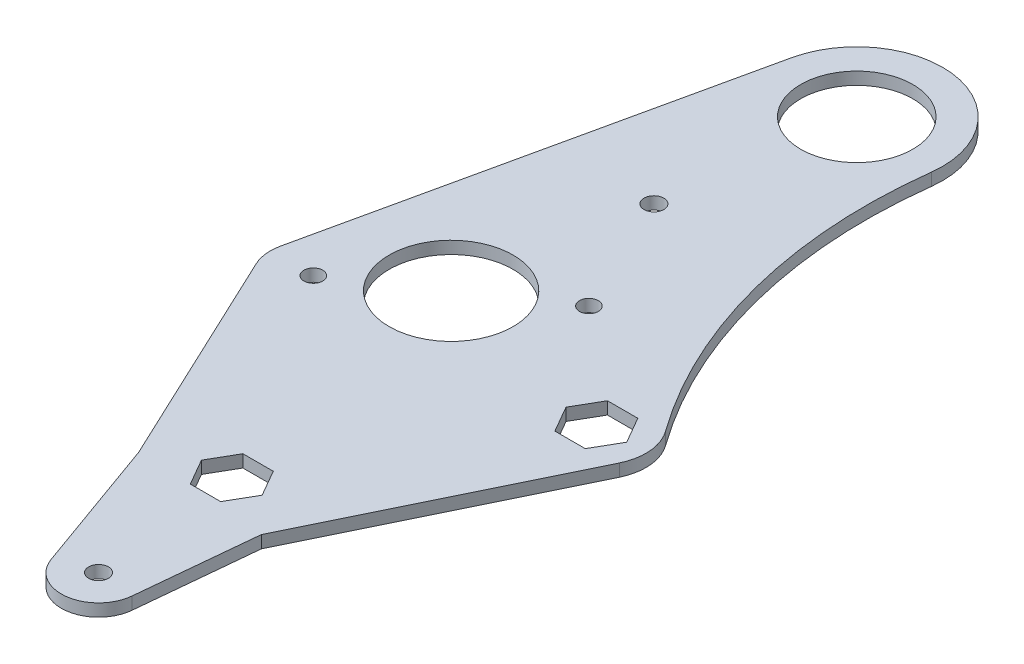
ISO-10303-21;
HEADER;
FILE_DESCRIPTION(('STEP AP214'),'2;1');
FILE_NAME('part.step','',(''),(''),'','','');
FILE_SCHEMA(('AUTOMOTIVE_DESIGN { 1 0 10303 214 1 1 1 1 }'));
ENDSEC;
DATA;
#1=APPLICATION_CONTEXT('core data for automotive mechanical design processes');
#2=APPLICATION_PROTOCOL_DEFINITION('international standard','automotive_design',2000,#1);
#3=PRODUCT_CONTEXT('',#1,'mechanical');
#4=PRODUCT('Part','Part','',(#3));
#5=PRODUCT_RELATED_PRODUCT_CATEGORY('part','',(#4));
#6=PRODUCT_DEFINITION_FORMATION('','',#4);
#7=PRODUCT_DEFINITION_CONTEXT('part definition',#1,'design');
#8=PRODUCT_DEFINITION('design','',#6,#7);
#9=PRODUCT_DEFINITION_SHAPE('','',#8);
#10=(LENGTH_UNIT() NAMED_UNIT(*) SI_UNIT(.MILLI.,.METRE.));
#11=(NAMED_UNIT(*) PLANE_ANGLE_UNIT() SI_UNIT($,.RADIAN.));
#12=(NAMED_UNIT(*) SI_UNIT($,.STERADIAN.) SOLID_ANGLE_UNIT());
#13=UNCERTAINTY_MEASURE_WITH_UNIT(LENGTH_MEASURE(1.E-05),#10,'distance_accuracy_value','');
#14=(GEOMETRIC_REPRESENTATION_CONTEXT(3) GLOBAL_UNCERTAINTY_ASSIGNED_CONTEXT((#13)) GLOBAL_UNIT_ASSIGNED_CONTEXT((#10,
#11,#12)) REPRESENTATION_CONTEXT('',''));
#15=CARTESIAN_POINT('',(0.,0.,0.));
#16=DIRECTION('',(0.,0.,1.));
#17=DIRECTION('',(1.,0.,0.));
#18=AXIS2_PLACEMENT_3D('',#15,#16,#17);
#19=CARTESIAN_POINT('',(0.,3.175,108.331));
#20=DIRECTION('',(0.,0.,-1.));
#21=DIRECTION('',(-1.,0.,0.));
#22=AXIS2_PLACEMENT_3D('',#19,#20,#21);
#23=PLANE('',#22);
#24=DIRECTION('',(1.,0.,0.));
#25=VECTOR('',#24,1.);
#26=CARTESIAN_POINT('',(0.,0.,108.331));
#27=LINE('',#26,#25);
#28=CARTESIAN_POINT('',(31.0388553380846,0.,108.331));
#29=VERTEX_POINT('',#28);
#30=CARTESIAN_POINT('',(38.8111446619154,0.,108.331));
#31=VERTEX_POINT('',#30);
#32=EDGE_CURVE('E286',#29,#31,#27,.T.);
#33=ORIENTED_EDGE('',*,*,#32,.F.);
#34=DIRECTION('',(0.,-1.,0.));
#35=VECTOR('',#34,1.);
#36=CARTESIAN_POINT('',(31.0388553380846,3.175,108.331));
#37=LINE('',#36,#35);
#38=CARTESIAN_POINT('',(31.0388553380846,3.175,108.331));
#39=VERTEX_POINT('',#38);
#40=EDGE_CURVE('E11',#39,#29,#37,.T.);
#41=ORIENTED_EDGE('',*,*,#40,.F.);
#42=DIRECTION('',(1.,0.,0.));
#43=VECTOR('',#42,1.);
#44=CARTESIAN_POINT('',(0.,3.175,108.331));
#45=LINE('',#44,#43);
#46=CARTESIAN_POINT('',(38.8111446619154,3.175,108.331));
#47=VERTEX_POINT('',#46);
#48=EDGE_CURVE('E665',#39,#47,#45,.T.);
#49=ORIENTED_EDGE('',*,*,#48,.T.);
#50=DIRECTION('',(0.,-1.,0.));
#51=VECTOR('',#50,1.);
#52=CARTESIAN_POINT('',(38.8111446619154,3.175,108.331));
#53=LINE('',#52,#51);
#54=EDGE_CURVE('E54',#47,#31,#53,.T.);
#55=ORIENTED_EDGE('',*,*,#54,.T.);
#56=EDGE_LOOP('',(#33,#41,#49,#55));
#57=FACE_BOUND('',#56,.T.);
#58=ADVANCED_FACE('F35',(#57),#23,.T.);
#59=CARTESIAN_POINT('',(-23.6295575051226,3.175,13.6425313864143));
#60=DIRECTION('',(0.866025403784438,0.,-0.5));
#61=DIRECTION('',(-0.5,0.,-0.866025403784438));
#62=AXIS2_PLACEMENT_3D('',#59,#60,#61);
#63=PLANE('',#62);
#64=DIRECTION('',(0.5,0.,0.866025403784438));
#65=VECTOR('',#64,1.);
#66=CARTESIAN_POINT('',(-23.6295575051226,0.,13.6425313864143));
#67=LINE('',#66,#65);
#68=CARTESIAN_POINT('',(27.1527106761692,0.,101.6));
#69=VERTEX_POINT('',#68);
#70=EDGE_CURVE('E288',#69,#29,#67,.T.);
#71=ORIENTED_EDGE('',*,*,#70,.F.);
#72=DIRECTION('',(0.,-1.,0.));
#73=VECTOR('',#72,1.);
#74=CARTESIAN_POINT('',(27.1527106761692,3.175,101.6));
#75=LINE('',#74,#73);
#76=CARTESIAN_POINT('',(27.1527106761692,3.175,101.6));
#77=VERTEX_POINT('',#76);
#78=EDGE_CURVE('E45',#77,#69,#75,.T.);
#79=ORIENTED_EDGE('',*,*,#78,.F.);
#80=DIRECTION('',(0.5,0.,0.866025403784438));
#81=VECTOR('',#80,1.);
#82=CARTESIAN_POINT('',(-23.6295575051226,3.175,13.6425313864143));
#83=LINE('',#82,#81);
#84=EDGE_CURVE('E667',#77,#39,#83,.T.);
#85=ORIENTED_EDGE('',*,*,#84,.T.);
#86=ORIENTED_EDGE('',*,*,#40,.T.);
#87=EDGE_LOOP('',(#71,#79,#85,#86));
#88=FACE_BOUND('',#87,.T.);
#89=ADVANCED_FACE('F399',(#88),#63,.T.);
#90=CARTESIAN_POINT('',(64.3586235193764,3.175,37.1574686135857));
#91=DIRECTION('',(0.866025403784439,0.,0.5));
#92=DIRECTION('',(0.5,0.,-0.866025403784439));
#93=AXIS2_PLACEMENT_3D('',#90,#91,#92);
#94=PLANE('',#93);
#95=DIRECTION('',(-0.5,0.,0.866025403784439));
#96=VECTOR('',#95,1.);
#97=CARTESIAN_POINT('',(64.3586235193764,0.,37.1574686135857));
#98=LINE('',#97,#96);
#99=CARTESIAN_POINT('',(31.0388553380846,0.,94.869));
#100=VERTEX_POINT('',#99);
#101=EDGE_CURVE('E291',#100,#69,#98,.T.);
#102=ORIENTED_EDGE('',*,*,#101,.F.);
#103=DIRECTION('',(0.,-1.,0.));
#104=VECTOR('',#103,1.);
#105=CARTESIAN_POINT('',(31.0388553380846,3.175,94.869));
#106=LINE('',#105,#104);
#107=CARTESIAN_POINT('',(31.0388553380846,3.175,94.869));
#108=VERTEX_POINT('',#107);
#109=EDGE_CURVE('E200',#108,#100,#106,.T.);
#110=ORIENTED_EDGE('',*,*,#109,.F.);
#111=DIRECTION('',(-0.5,0.,0.866025403784439));
#112=VECTOR('',#111,1.);
#113=CARTESIAN_POINT('',(64.3586235193764,3.175,37.1574686135857));
#114=LINE('',#113,#112);
#115=EDGE_CURVE('E211',#108,#77,#114,.T.);
#116=ORIENTED_EDGE('',*,*,#115,.T.);
#117=ORIENTED_EDGE('',*,*,#78,.T.);
#118=EDGE_LOOP('',(#102,#110,#116,#117));
#119=FACE_BOUND('',#118,.T.);
#120=ADVANCED_FACE('F404',(#119),#94,.T.);
#121=CARTESIAN_POINT('',(0.,3.175,94.869));
#122=DIRECTION('',(0.,0.,1.));
#123=DIRECTION('',(1.,0.,0.));
#124=AXIS2_PLACEMENT_3D('',#121,#122,#123);
#125=PLANE('',#124);
#126=DIRECTION('',(-1.,0.,0.));
#127=VECTOR('',#126,1.);
#128=CARTESIAN_POINT('',(0.,0.,94.869));
#129=LINE('',#128,#127);
#130=CARTESIAN_POINT('',(38.8111446619154,0.,94.8689999999999));
#131=VERTEX_POINT('',#130);
#132=EDGE_CURVE('E196',#131,#100,#129,.T.);
#133=ORIENTED_EDGE('',*,*,#132,.F.);
#134=DIRECTION('',(0.,-1.,0.));
#135=VECTOR('',#134,1.);
#136=CARTESIAN_POINT('',(38.8111446619154,3.175,94.8689999999999));
#137=LINE('',#136,#135);
#138=CARTESIAN_POINT('',(38.8111446619154,3.175,94.8689999999999));
#139=VERTEX_POINT('',#138);
#140=EDGE_CURVE('E191',#139,#131,#137,.T.);
#141=ORIENTED_EDGE('',*,*,#140,.F.);
#142=DIRECTION('',(-1.,0.,0.));
#143=VECTOR('',#142,1.);
#144=CARTESIAN_POINT('',(0.,3.175,94.869));
#145=LINE('',#144,#143);
#146=EDGE_CURVE('E194',#139,#108,#145,.T.);
#147=ORIENTED_EDGE('',*,*,#146,.T.);
#148=ORIENTED_EDGE('',*,*,#109,.T.);
#149=EDGE_LOOP('',(#133,#141,#147,#148));
#150=FACE_BOUND('',#149,.T.);
#151=ADVANCED_FACE('F193',(#150),#125,.T.);
#152=CARTESIAN_POINT('',(-11.9711235193764,3.175,6.91153138641425));
#153=DIRECTION('',(-0.866025403784438,0.,0.5));
#154=DIRECTION('',(0.5,0.,0.866025403784438));
#155=AXIS2_PLACEMENT_3D('',#152,#153,#154);
#156=PLANE('',#155);
#157=DIRECTION('',(-0.5,0.,-0.866025403784438));
#158=VECTOR('',#157,1.);
#159=CARTESIAN_POINT('',(-11.9711235193764,0.,6.91153138641425));
#160=LINE('',#159,#158);
#161=CARTESIAN_POINT('',(42.6972893238308,0.,101.6));
#162=VERTEX_POINT('',#161);
#163=EDGE_CURVE('E295',#162,#131,#160,.T.);
#164=ORIENTED_EDGE('',*,*,#163,.F.);
#165=DIRECTION('',(0.,-1.,0.));
#166=VECTOR('',#165,1.);
#167=CARTESIAN_POINT('',(42.6972893238308,3.175,101.6));
#168=LINE('',#167,#166);
#169=CARTESIAN_POINT('',(42.6972893238308,3.175,101.6));
#170=VERTEX_POINT('',#169);
#171=EDGE_CURVE('E121',#170,#162,#168,.T.);
#172=ORIENTED_EDGE('',*,*,#171,.F.);
#173=DIRECTION('',(-0.5,0.,-0.866025403784438));
#174=VECTOR('',#173,1.);
#175=CARTESIAN_POINT('',(-11.9711235193764,3.175,6.91153138641425));
#176=LINE('',#175,#174);
#177=EDGE_CURVE('E208',#170,#139,#176,.T.);
#178=ORIENTED_EDGE('',*,*,#177,.T.);
#179=ORIENTED_EDGE('',*,*,#140,.T.);
#180=EDGE_LOOP('',(#164,#172,#178,#179));
#181=FACE_BOUND('',#180,.T.);
#182=ADVANCED_FACE('F213',(#181),#156,.T.);
#183=CARTESIAN_POINT('',(-75.119909549666,3.175,43.3705000000001));
#184=DIRECTION('',(0.866025403784438,0.,-0.5));
#185=DIRECTION('',(-0.5,0.,-0.866025403784438));
#186=AXIS2_PLACEMENT_3D('',#183,#184,#185);
#187=PLANE('',#186);
#188=DIRECTION('',(0.5,0.,0.866025403784438));
#189=VECTOR('',#188,1.);
#190=CARTESIAN_POINT('',(-75.119909549666,0.,43.3705000000001));
#191=LINE('',#190,#189);
#192=CARTESIAN_POINT('',(-7.77228932383074,0.,160.02));
#193=VERTEX_POINT('',#192);
#194=CARTESIAN_POINT('',(-3.88614466191537,0.,166.751));
#195=VERTEX_POINT('',#194);
#196=EDGE_CURVE('E268',#193,#195,#191,.T.);
#197=ORIENTED_EDGE('',*,*,#196,.F.);
#198=DIRECTION('',(0.,-1.,0.));
#199=VECTOR('',#198,1.);
#200=CARTESIAN_POINT('',(-7.77228932383074,3.175,160.02));
#201=LINE('',#200,#199);
#202=CARTESIAN_POINT('',(-7.77228932383074,3.175,160.02));
#203=VERTEX_POINT('',#202);
#204=EDGE_CURVE('E302',#203,#193,#201,.T.);
#205=ORIENTED_EDGE('',*,*,#204,.F.);
#206=DIRECTION('',(0.5,0.,0.866025403784438));
#207=VECTOR('',#206,1.);
#208=CARTESIAN_POINT('',(-75.119909549666,3.175,43.3705000000001));
#209=LINE('',#208,#207);
#210=CARTESIAN_POINT('',(-3.88614466191537,3.175,166.751));
#211=VERTEX_POINT('',#210);
#212=EDGE_CURVE('E686',#203,#211,#209,.T.);
#213=ORIENTED_EDGE('',*,*,#212,.T.);
#214=DIRECTION('',(0.,-1.,0.));
#215=VECTOR('',#214,1.);
#216=CARTESIAN_POINT('',(-3.88614466191537,3.175,166.751));
#217=LINE('',#216,#215);
#218=EDGE_CURVE('E306',#211,#195,#217,.T.);
#219=ORIENTED_EDGE('',*,*,#218,.T.);
#220=EDGE_LOOP('',(#197,#205,#213,#219));
#221=FACE_BOUND('',#220,.T.);
#222=ADVANCED_FACE('F429',(#221),#187,.T.);
#223=CARTESIAN_POINT('',(63.4614755639198,3.175,36.6394999999999));
#224=DIRECTION('',(0.866025403784439,0.,0.499999999999999));
#225=DIRECTION('',(0.5,0.,-0.866025403784439));
#226=AXIS2_PLACEMENT_3D('',#223,#224,#225);
#227=PLANE('',#226);
#228=DIRECTION('',(-0.5,0.,0.866025403784439));
#229=VECTOR('',#228,1.);
#230=CARTESIAN_POINT('',(63.4614755639198,0.,36.6394999999999));
#231=LINE('',#230,#229);
#232=CARTESIAN_POINT('',(-3.88614466191538,0.,153.289));
#233=VERTEX_POINT('',#232);
#234=EDGE_CURVE('E271',#233,#193,#231,.T.);
#235=ORIENTED_EDGE('',*,*,#234,.F.);
#236=DIRECTION('',(0.,-1.,0.));
#237=VECTOR('',#236,1.);
#238=CARTESIAN_POINT('',(-3.88614466191538,3.175,153.289));
#239=LINE('',#238,#237);
#240=CARTESIAN_POINT('',(-3.88614466191538,3.175,153.289));
#241=VERTEX_POINT('',#240);
#242=EDGE_CURVE('E314',#241,#233,#239,.T.);
#243=ORIENTED_EDGE('',*,*,#242,.F.);
#244=DIRECTION('',(-0.5,0.,0.866025403784439));
#245=VECTOR('',#244,1.);
#246=CARTESIAN_POINT('',(63.4614755639198,3.175,36.6394999999999));
#247=LINE('',#246,#245);
#248=EDGE_CURVE('E683',#241,#203,#247,.T.);
#249=ORIENTED_EDGE('',*,*,#248,.T.);
#250=ORIENTED_EDGE('',*,*,#204,.T.);
#251=EDGE_LOOP('',(#235,#243,#249,#250));
#252=FACE_BOUND('',#251,.T.);
#253=ADVANCED_FACE('F425',(#252),#227,.T.);
#254=CARTESIAN_POINT('',(0.,3.175,153.289));
#255=DIRECTION('',(0.,0.,1.));
#256=DIRECTION('',(1.,0.,0.));
#257=AXIS2_PLACEMENT_3D('',#254,#255,#256);
#258=PLANE('',#257);
#259=DIRECTION('',(-1.,0.,0.));
#260=VECTOR('',#259,1.);
#261=CARTESIAN_POINT('',(0.,0.,153.289));
#262=LINE('',#261,#260);
#263=CARTESIAN_POINT('',(3.88614466191534,0.,153.289));
#264=VERTEX_POINT('',#263);
#265=EDGE_CURVE('E274',#264,#233,#262,.T.);
#266=ORIENTED_EDGE('',*,*,#265,.F.);
#267=DIRECTION('',(0.,-1.,0.));
#268=VECTOR('',#267,1.);
#269=CARTESIAN_POINT('',(3.88614466191534,3.175,153.289));
#270=LINE('',#269,#268);
#271=CARTESIAN_POINT('',(3.88614466191534,3.175,153.289));
#272=VERTEX_POINT('',#271);
#273=EDGE_CURVE('E312',#272,#264,#270,.T.);
#274=ORIENTED_EDGE('',*,*,#273,.F.);
#275=DIRECTION('',(-1.,0.,0.));
#276=VECTOR('',#275,1.);
#277=CARTESIAN_POINT('',(0.,3.175,153.289));
#278=LINE('',#277,#276);
#279=EDGE_CURVE('E680',#272,#241,#278,.T.);
#280=ORIENTED_EDGE('',*,*,#279,.T.);
#281=ORIENTED_EDGE('',*,*,#242,.T.);
#282=EDGE_LOOP('',(#266,#274,#280,#281));
#283=FACE_BOUND('',#282,.T.);
#284=ADVANCED_FACE('F421',(#283),#258,.T.);
#285=CARTESIAN_POINT('',(-63.46147556392,3.175,36.6395000000001));
#286=DIRECTION('',(-0.866025403784438,0.,0.500000000000001));
#287=DIRECTION('',(0.500000000000001,0.,0.866025403784438));
#288=AXIS2_PLACEMENT_3D('',#285,#286,#287);
#289=PLANE('',#288);
#290=DIRECTION('',(-0.500000000000001,0.,-0.866025403784438));
#291=VECTOR('',#290,1.);
#292=CARTESIAN_POINT('',(-63.46147556392,0.,36.6395000000001));
#293=LINE('',#292,#291);
#294=CARTESIAN_POINT('',(7.77228932383074,0.,160.02));
#295=VERTEX_POINT('',#294);
#296=EDGE_CURVE('E277',#295,#264,#293,.T.);
#297=ORIENTED_EDGE('',*,*,#296,.F.);
#298=DIRECTION('',(0.,-1.,0.));
#299=VECTOR('',#298,1.);
#300=CARTESIAN_POINT('',(7.77228932383074,3.175,160.02));
#301=LINE('',#300,#299);
#302=CARTESIAN_POINT('',(7.77228932383074,3.175,160.02));
#303=VERTEX_POINT('',#302);
#304=EDGE_CURVE('E310',#303,#295,#301,.T.);
#305=ORIENTED_EDGE('',*,*,#304,.F.);
#306=DIRECTION('',(-0.500000000000001,0.,-0.866025403784438));
#307=VECTOR('',#306,1.);
#308=CARTESIAN_POINT('',(-63.46147556392,3.175,36.6395000000001));
#309=LINE('',#308,#307);
#310=EDGE_CURVE('E677',#303,#272,#309,.T.);
#311=ORIENTED_EDGE('',*,*,#310,.T.);
#312=ORIENTED_EDGE('',*,*,#273,.T.);
#313=EDGE_LOOP('',(#297,#305,#311,#312));
#314=FACE_BOUND('',#313,.T.);
#315=ADVANCED_FACE('F417',(#314),#289,.T.);
#316=CARTESIAN_POINT('',(75.1199095496659,3.175,43.3704999999999));
#317=DIRECTION('',(-0.866025403784439,0.,-0.499999999999999));
#318=DIRECTION('',(-0.499999999999999,0.,0.866025403784439));
#319=AXIS2_PLACEMENT_3D('',#316,#317,#318);
#320=PLANE('',#319);
#321=DIRECTION('',(0.499999999999999,0.,-0.866025403784439));
#322=VECTOR('',#321,1.);
#323=CARTESIAN_POINT('',(75.1199095496659,0.,43.3704999999999));
#324=LINE('',#323,#322);
#325=CARTESIAN_POINT('',(3.88614466191536,0.,166.751));
#326=VERTEX_POINT('',#325);
#327=EDGE_CURVE('E280',#326,#295,#324,.T.);
#328=ORIENTED_EDGE('',*,*,#327,.F.);
#329=DIRECTION('',(0.,-1.,0.));
#330=VECTOR('',#329,1.);
#331=CARTESIAN_POINT('',(3.88614466191536,3.175,166.751));
#332=LINE('',#331,#330);
#333=CARTESIAN_POINT('',(3.88614466191536,3.175,166.751));
#334=VERTEX_POINT('',#333);
#335=EDGE_CURVE('E308',#334,#326,#332,.T.);
#336=ORIENTED_EDGE('',*,*,#335,.F.);
#337=DIRECTION('',(0.499999999999999,0.,-0.866025403784439));
#338=VECTOR('',#337,1.);
#339=CARTESIAN_POINT('',(75.1199095496659,3.175,43.3704999999999));
#340=LINE('',#339,#338);
#341=EDGE_CURVE('E674',#334,#303,#340,.T.);
#342=ORIENTED_EDGE('',*,*,#341,.T.);
#343=ORIENTED_EDGE('',*,*,#304,.T.);
#344=EDGE_LOOP('',(#328,#336,#342,#343));
#345=FACE_BOUND('',#344,.T.);
#346=ADVANCED_FACE('F414',(#345),#320,.T.);
#347=CARTESIAN_POINT('',(34.925,3.175,101.6));
#348=DIRECTION('',(0.,-1.,0.));
#349=DIRECTION('',(0.,0.,-1.));
#350=AXIS2_PLACEMENT_3D('',#347,#348,#349);
#351=CYLINDRICAL_SURFACE('',#350,12.7);
#352=CARTESIAN_POINT('',(34.925,0.,101.6));
#353=DIRECTION('',(0.,1.,0.));
#354=DIRECTION('',(0.,0.,1.));
#355=AXIS2_PLACEMENT_3D('',#352,#353,#354);
#356=CIRCLE('',#355,12.7);
#357=CARTESIAN_POINT('',(45.2316491844155,0.,94.1795564425443));
#358=VERTEX_POINT('',#357);
#359=CARTESIAN_POINT('',(46.351547637577,0.,107.142924236013));
#360=VERTEX_POINT('',#359);
#361=EDGE_CURVE('E223',#358,#360,#356,.F.);
#362=ORIENTED_EDGE('',*,*,#361,.F.);
#363=DIRECTION('',(0.,-1.,0.));
#364=VECTOR('',#363,1.);
#365=CARTESIAN_POINT('',(45.2316491844155,3.175,94.1795564425443));
#366=LINE('',#365,#364);
#367=CARTESIAN_POINT('',(45.2316491844155,3.175,94.1795564425443));
#368=VERTEX_POINT('',#367);
#369=EDGE_CURVE('E39',#368,#358,#366,.T.);
#370=ORIENTED_EDGE('',*,*,#369,.F.);
#371=CARTESIAN_POINT('',(34.925,3.175,101.6));
#372=DIRECTION('',(0.,1.,0.));
#373=DIRECTION('',(0.,0.,1.));
#374=AXIS2_PLACEMENT_3D('',#371,#372,#373);
#375=CIRCLE('',#374,12.7);
#376=CARTESIAN_POINT('',(46.351547637577,3.175,107.142924236013));
#377=VERTEX_POINT('',#376);
#378=EDGE_CURVE('E347',#368,#377,#375,.F.);
#379=ORIENTED_EDGE('',*,*,#378,.T.);
#380=DIRECTION('',(0.,-1.,0.));
#381=VECTOR('',#380,1.);
#382=CARTESIAN_POINT('',(46.351547637577,3.175,107.142924236013));
#383=LINE('',#382,#381);
#384=EDGE_CURVE('E216',#377,#360,#383,.T.);
#385=ORIENTED_EDGE('',*,*,#384,.T.);
#386=EDGE_LOOP('',(#362,#370,#379,#385));
#387=FACE_BOUND('',#386,.T.);
#388=ADVANCED_FACE('F346',(#387),#351,.T.);
#389=CARTESIAN_POINT('',(150.263394411146,3.175,18.5602039982491));
#390=DIRECTION('',(0.,-1.,0.));
#391=DIRECTION('',(0.,0.,-1.));
#392=AXIS2_PLACEMENT_3D('',#389,#390,#391);
#393=CYLINDRICAL_SURFACE('',#392,129.421613223863);
#394=CARTESIAN_POINT('',(150.263394411146,0.,18.5602039982491));
#395=DIRECTION('',(0.,1.,0.));
#396=DIRECTION('',(0.,0.,1.));
#397=AXIS2_PLACEMENT_3D('',#394,#395,#396);
#398=CIRCLE('',#397,129.421613223863);
#399=CARTESIAN_POINT('',(21.8178960393026,0.,2.6948985339308));
#400=VERTEX_POINT('',#399);
#401=EDGE_CURVE('E226',#358,#400,#398,.F.);
#402=ORIENTED_EDGE('',*,*,#401,.T.);
#403=DIRECTION('',(0.,-1.,0.));
#404=VECTOR('',#403,1.);
#405=CARTESIAN_POINT('',(21.8178960393026,3.175,2.6948985339308));
#406=LINE('',#405,#404);
#407=CARTESIAN_POINT('',(21.8178960393026,3.175,2.6948985339308));
#408=VERTEX_POINT('',#407);
#409=EDGE_CURVE('E332',#408,#400,#406,.T.);
#410=ORIENTED_EDGE('',*,*,#409,.F.);
#411=CARTESIAN_POINT('',(150.263394411146,3.175,18.5602039982491));
#412=DIRECTION('',(0.,1.,0.));
#413=DIRECTION('',(0.,0.,1.));
#414=AXIS2_PLACEMENT_3D('',#411,#412,#413);
#415=CIRCLE('',#414,129.421613223863);
#416=EDGE_CURVE('E340',#368,#408,#415,.F.);
#417=ORIENTED_EDGE('',*,*,#416,.F.);
#418=ORIENTED_EDGE('',*,*,#369,.T.);
#419=EDGE_LOOP('',(#402,#410,#417,#418));
#420=FACE_BOUND('',#419,.T.);
#421=ADVANCED_FACE('F338',(#420),#393,.F.);
#422=CARTESIAN_POINT('',(0.,3.175,0.));
#423=DIRECTION('',(0.,-1.,0.));
#424=DIRECTION('',(0.,0.,-1.));
#425=AXIS2_PLACEMENT_3D('',#422,#423,#424);
#426=CYLINDRICAL_SURFACE('',#425,21.9837);
#427=CARTESIAN_POINT('',(0.,0.,0.));
#428=DIRECTION('',(0.,1.,0.));
#429=DIRECTION('',(0.,0.,1.));
#430=AXIS2_PLACEMENT_3D('',#427,#428,#429);
#431=CIRCLE('',#430,21.9837);
#432=CARTESIAN_POINT('',(-21.4676468409393,0.,-4.73531464664263));
#433=VERTEX_POINT('',#432);
#434=EDGE_CURVE('E229',#400,#433,#431,.T.);
#435=ORIENTED_EDGE('',*,*,#434,.T.);
#436=DIRECTION('',(0.,-1.,0.));
#437=VECTOR('',#436,1.);
#438=CARTESIAN_POINT('',(-21.4676468409393,3.175,-4.73531464664263));
#439=LINE('',#438,#437);
#440=CARTESIAN_POINT('',(-21.4676468409393,3.175,-4.73531464664263));
#441=VERTEX_POINT('',#440);
#442=EDGE_CURVE('E331',#441,#433,#439,.T.);
#443=ORIENTED_EDGE('',*,*,#442,.F.);
#444=CARTESIAN_POINT('',(0.,3.175,0.));
#445=DIRECTION('',(0.,1.,0.));
#446=DIRECTION('',(0.,0.,1.));
#447=AXIS2_PLACEMENT_3D('',#444,#445,#446);
#448=CIRCLE('',#447,21.9837);
#449=EDGE_CURVE('E711',#408,#441,#448,.T.);
#450=ORIENTED_EDGE('',*,*,#449,.F.);
#451=ORIENTED_EDGE('',*,*,#409,.T.);
#452=EDGE_LOOP('',(#435,#443,#450,#451));
#453=FACE_BOUND('',#452,.T.);
#454=ADVANCED_FACE('F389',(#453),#426,.T.);
#455=CARTESIAN_POINT('',(-21.4676468409393,3.175,-4.73531464664263));
#456=DIRECTION('',(-0.97652564586213,0.,-0.215401167530608));
#457=DIRECTION('',(-0.215401167530608,0.,0.976525645862131));
#458=AXIS2_PLACEMENT_3D('',#455,#456,#457);
#459=PLANE('',#458);
#460=DIRECTION('',(0.215401167530608,0.,-0.976525645862131));
#461=VECTOR('',#460,1.);
#462=CARTESIAN_POINT('',(-21.4676468409393,0.,-4.73531464664263));
#463=LINE('',#462,#461);
#464=CARTESIAN_POINT('',(-45.1019067239605,0.,102.411091110239));
#465=VERTEX_POINT('',#464);
#466=EDGE_CURVE('E232',#465,#433,#463,.T.);
#467=ORIENTED_EDGE('',*,*,#466,.F.);
#468=DIRECTION('',(0.,-1.,0.));
#469=VECTOR('',#468,1.);
#470=CARTESIAN_POINT('',(-45.1019067239605,3.175,102.411091110239));
#471=LINE('',#470,#469);
#472=CARTESIAN_POINT('',(-45.1019067239605,3.175,102.411091110239));
#473=VERTEX_POINT('',#472);
#474=EDGE_CURVE('E329',#473,#465,#471,.T.);
#475=ORIENTED_EDGE('',*,*,#474,.F.);
#476=DIRECTION('',(0.215401167530608,0.,-0.976525645862131));
#477=VECTOR('',#476,1.);
#478=CARTESIAN_POINT('',(-21.4676468409393,3.175,-4.73531464664263));
#479=LINE('',#478,#477);
#480=EDGE_CURVE('E388',#473,#441,#479,.T.);
#481=ORIENTED_EDGE('',*,*,#480,.T.);
#482=ORIENTED_EDGE('',*,*,#442,.T.);
#483=EDGE_LOOP('',(#467,#475,#481,#482));
#484=FACE_BOUND('',#483,.T.);
#485=ADVANCED_FACE('F386',(#484),#459,.T.);
#486=CARTESIAN_POINT('',(-34.362191084382,3.175,104.780048134066));
#487=DIRECTION('',(0.,-1.,0.));
#488=DIRECTION('',(0.,0.,-1.));
#489=AXIS2_PLACEMENT_3D('',#486,#487,#488);
#490=CYLINDRICAL_SURFACE('',#489,10.997883860077);
#491=CARTESIAN_POINT('',(-34.362191084382,0.,104.780048134066));
#492=DIRECTION('',(0.,1.,0.));
#493=DIRECTION('',(0.,0.,1.));
#494=AXIS2_PLACEMENT_3D('',#491,#492,#493);
#495=CIRCLE('',#494,10.997883860077);
#496=CARTESIAN_POINT('',(-44.312542058008,0.,109.464486723844));
#497=VERTEX_POINT('',#496);
#498=EDGE_CURVE('E235',#497,#465,#495,.F.);
#499=ORIENTED_EDGE('',*,*,#498,.F.);
#500=DIRECTION('',(0.,-1.,0.));
#501=VECTOR('',#500,1.);
#502=CARTESIAN_POINT('',(-44.312542058008,3.175,109.464486723844));
#503=LINE('',#502,#501);
#504=CARTESIAN_POINT('',(-44.312542058008,3.175,109.464486723844));
#505=VERTEX_POINT('',#504);
#506=EDGE_CURVE('E327',#505,#497,#503,.T.);
#507=ORIENTED_EDGE('',*,*,#506,.F.);
#508=CARTESIAN_POINT('',(-34.362191084382,3.175,104.780048134066));
#509=DIRECTION('',(0.,1.,0.));
#510=DIRECTION('',(0.,0.,1.));
#511=AXIS2_PLACEMENT_3D('',#508,#509,#510);
#512=CIRCLE('',#511,10.997883860077);
#513=EDGE_CURVE('E382',#505,#473,#512,.F.);
#514=ORIENTED_EDGE('',*,*,#513,.T.);
#515=ORIENTED_EDGE('',*,*,#474,.T.);
#516=EDGE_LOOP('',(#499,#507,#514,#515));
#517=FACE_BOUND('',#516,.T.);
#518=ADVANCED_FACE('F380',(#517),#490,.T.);
#519=CARTESIAN_POINT('',(-78.4574531781532,3.175,36.9362972519881));
#520=DIRECTION('',(-0.904751414019414,0.,0.425939994400469));
#521=DIRECTION('',(0.425939994400469,0.,0.904751414019414));
#522=AXIS2_PLACEMENT_3D('',#519,#520,#521);
#523=PLANE('',#522);
#524=DIRECTION('',(-0.425939994400469,0.,-0.904751414019414));
#525=VECTOR('',#524,1.);
#526=CARTESIAN_POINT('',(-78.4574531781532,0.,36.9362972519881));
#527=LINE('',#526,#525);
#528=CARTESIAN_POINT('',(-17.5479197227193,0.,166.31599215158));
#529=VERTEX_POINT('',#528);
#530=EDGE_CURVE('E238',#529,#497,#527,.T.);
#531=ORIENTED_EDGE('',*,*,#530,.F.);
#532=DIRECTION('',(0.,-1.,0.));
#533=VECTOR('',#532,1.);
#534=CARTESIAN_POINT('',(-17.5479197227193,3.175,166.31599215158));
#535=LINE('',#534,#533);
#536=CARTESIAN_POINT('',(-17.5479197227193,3.175,166.31599215158));
#537=VERTEX_POINT('',#536);
#538=EDGE_CURVE('E325',#537,#529,#535,.T.);
#539=ORIENTED_EDGE('',*,*,#538,.F.);
#540=DIRECTION('',(-0.425939994400469,0.,-0.904751414019414));
#541=VECTOR('',#540,1.);
#542=CARTESIAN_POINT('',(-78.4574531781532,3.175,36.9362972519881));
#543=LINE('',#542,#541);
#544=EDGE_CURVE('E376',#537,#505,#543,.T.);
#545=ORIENTED_EDGE('',*,*,#544,.T.);
#546=ORIENTED_EDGE('',*,*,#506,.T.);
#547=EDGE_LOOP('',(#531,#539,#545,#546));
#548=FACE_BOUND('',#547,.T.);
#549=ADVANCED_FACE('F373',(#548),#523,.T.);
#550=CARTESIAN_POINT('',(-68.4133876320438,3.175,24.5459381169091));
#551=DIRECTION('',(-0.941250282180558,0.,0.337709795971363));
#552=DIRECTION('',(0.337709795971363,0.,0.941250282180558));
#553=AXIS2_PLACEMENT_3D('',#550,#551,#552);
#554=PLANE('',#553);
#555=DIRECTION('',(-0.337709795971363,0.,-0.941250282180559));
#556=VECTOR('',#555,1.);
#557=CARTESIAN_POINT('',(-68.4133876320438,0.,24.5459381169091));
#558=LINE('',#557,#556);
#559=CARTESIAN_POINT('',(-4.98289686650005,0.,201.336685806627));
#560=VERTEX_POINT('',#559);
#561=EDGE_CURVE('E241',#560,#529,#558,.T.);
#562=ORIENTED_EDGE('',*,*,#561,.F.);
#563=DIRECTION('',(0.,-1.,0.));
#564=VECTOR('',#563,1.);
#565=CARTESIAN_POINT('',(-4.98289686650005,3.175,201.336685806627));
#566=LINE('',#565,#564);
#567=CARTESIAN_POINT('',(-4.98289686650005,3.175,201.336685806627));
#568=VERTEX_POINT('',#567);
#569=EDGE_CURVE('E323',#568,#560,#566,.T.);
#570=ORIENTED_EDGE('',*,*,#569,.F.);
#571=DIRECTION('',(-0.337709795971363,0.,-0.941250282180559));
#572=VECTOR('',#571,1.);
#573=CARTESIAN_POINT('',(-68.4133876320438,3.175,24.5459381169091));
#574=LINE('',#573,#572);
#575=EDGE_CURVE('E369',#568,#537,#574,.T.);
#576=ORIENTED_EDGE('',*,*,#575,.T.);
#577=ORIENTED_EDGE('',*,*,#538,.T.);
#578=EDGE_LOOP('',(#562,#570,#576,#577));
#579=FACE_BOUND('',#578,.T.);
#580=ADVANCED_FACE('F368',(#579),#554,.T.);
#581=CARTESIAN_POINT('',(3.98251207126977,3.175,198.12));
#582=DIRECTION('',(0.,-1.,0.));
#583=DIRECTION('',(0.,0.,-1.));
#584=AXIS2_PLACEMENT_3D('',#581,#582,#583);
#585=CYLINDRICAL_SURFACE('',#584,9.52500000000001);
#586=CARTESIAN_POINT('',(3.98251207126977,0.,198.12));
#587=DIRECTION('',(0.,1.,0.));
#588=DIRECTION('',(0.,0.,1.));
#589=AXIS2_PLACEMENT_3D('',#586,#587,#588);
#590=CIRCLE('',#589,9.52500000000001);
#591=CARTESIAN_POINT('',(13.4625503036177,0.,199.044391753112));
#592=VERTEX_POINT('',#591);
#593=EDGE_CURVE('E244',#560,#592,#590,.T.);
#594=ORIENTED_EDGE('',*,*,#593,.T.);
#595=DIRECTION('',(0.,-1.,0.));
#596=VECTOR('',#595,1.);
#597=CARTESIAN_POINT('',(13.4625503036177,3.175,199.044391753112));
#598=LINE('',#597,#596);
#599=CARTESIAN_POINT('',(13.4625503036177,3.175,199.044391753112));
#600=VERTEX_POINT('',#599);
#601=EDGE_CURVE('E320',#600,#592,#598,.T.);
#602=ORIENTED_EDGE('',*,*,#601,.F.);
#603=CARTESIAN_POINT('',(3.98251207126977,3.175,198.12));
#604=DIRECTION('',(0.,1.,0.));
#605=DIRECTION('',(0.,0.,1.));
#606=AXIS2_PLACEMENT_3D('',#603,#604,#605);
#607=CIRCLE('',#606,9.52500000000001);
#608=EDGE_CURVE('E364',#568,#600,#607,.T.);
#609=ORIENTED_EDGE('',*,*,#608,.F.);
#610=ORIENTED_EDGE('',*,*,#569,.T.);
#611=EDGE_LOOP('',(#594,#602,#609,#610));
#612=FACE_BOUND('',#611,.T.);
#613=ADVANCED_FACE('F363',(#612),#585,.T.);
#614=CARTESIAN_POINT('',(32.5616287524502,3.175,3.175061149431));
#615=DIRECTION('',(-0.995279604445981,0.,-0.0970490029513558));
#616=DIRECTION('',(-0.0970490029513558,0.,0.995279604445981));
#617=AXIS2_PLACEMENT_3D('',#614,#615,#616);
#618=PLANE('',#617);
#619=DIRECTION('',(0.0970490029513558,0.,-0.995279604445981));
#620=VECTOR('',#619,1.);
#621=CARTESIAN_POINT('',(32.5616287524502,0.,3.175061149431));
#622=LINE('',#621,#620);
#623=CARTESIAN_POINT('',(16.4039739123351,0.,168.878817282865));
#624=VERTEX_POINT('',#623);
#625=EDGE_CURVE('E247',#592,#624,#622,.T.);
#626=ORIENTED_EDGE('',*,*,#625,.T.);
#627=DIRECTION('',(0.,-1.,0.));
#628=VECTOR('',#627,1.);
#629=CARTESIAN_POINT('',(16.4039739123351,3.175,168.878817282865));
#630=LINE('',#629,#628);
#631=CARTESIAN_POINT('',(16.4039739123351,3.175,168.878817282865));
#632=VERTEX_POINT('',#631);
#633=EDGE_CURVE('E318',#632,#624,#630,.T.);
#634=ORIENTED_EDGE('',*,*,#633,.F.);
#635=DIRECTION('',(0.0970490029513558,0.,-0.995279604445981));
#636=VECTOR('',#635,1.);
#637=CARTESIAN_POINT('',(32.5616287524502,3.175,3.175061149431));
#638=LINE('',#637,#636);
#639=EDGE_CURVE('E359',#600,#632,#638,.T.);
#640=ORIENTED_EDGE('',*,*,#639,.F.);
#641=ORIENTED_EDGE('',*,*,#601,.T.);
#642=EDGE_LOOP('',(#626,#634,#640,#641));
#643=FACE_BOUND('',#642,.T.);
#644=ADVANCED_FACE('F358',(#643),#618,.F.);
#645=CARTESIAN_POINT('',(0.,3.175,166.751));
#646=DIRECTION('',(0.,0.,-1.));
#647=DIRECTION('',(-1.,0.,0.));
#648=AXIS2_PLACEMENT_3D('',#645,#646,#647);
#649=PLANE('',#648);
#650=DIRECTION('',(1.,0.,0.));
#651=VECTOR('',#650,1.);
#652=CARTESIAN_POINT('',(0.,0.,166.751));
#653=LINE('',#652,#651);
#654=EDGE_CURVE('E283',#195,#326,#653,.T.);
#655=ORIENTED_EDGE('',*,*,#654,.F.);
#656=ORIENTED_EDGE('',*,*,#218,.F.);
#657=DIRECTION('',(1.,0.,0.));
#658=VECTOR('',#657,1.);
#659=CARTESIAN_POINT('',(0.,3.175,166.751));
#660=LINE('',#659,#658);
#661=EDGE_CURVE('E668',#211,#334,#660,.T.);
#662=ORIENTED_EDGE('',*,*,#661,.T.);
#663=ORIENTED_EDGE('',*,*,#335,.T.);
#664=EDGE_LOOP('',(#655,#656,#662,#663));
#665=FACE_BOUND('',#664,.T.);
#666=ADVANCED_FACE('F409',(#665),#649,.T.);
#667=CARTESIAN_POINT('',(0.,3.175,0.));
#668=DIRECTION('',(0.,-1.,0.));
#669=DIRECTION('',(0.,0.,-1.));
#670=AXIS2_PLACEMENT_3D('',#667,#668,#669);
#671=CYLINDRICAL_SURFACE('',#670,14.3637);
#672=CARTESIAN_POINT('',(0.,3.175,0.));
#673=DIRECTION('',(0.,1.,0.));
#674=DIRECTION('',(0.,0.,1.));
#675=AXIS2_PLACEMENT_3D('',#672,#673,#674);
#676=CIRCLE('',#675,14.3637);
#677=CARTESIAN_POINT('',(0.,3.175,14.3637));
#678=VERTEX_POINT('',#677);
#679=EDGE_CURVE('E689',#678,#678,#676,.T.);
#680=ORIENTED_EDGE('',*,*,#679,.T.);
#681=EDGE_LOOP('',(#680));
#682=FACE_BOUND('',#681,.T.);
#683=CARTESIAN_POINT('',(0.,0.,0.));
#684=DIRECTION('',(0.,1.,0.));
#685=DIRECTION('',(0.,0.,1.));
#686=AXIS2_PLACEMENT_3D('',#683,#684,#685);
#687=CIRCLE('',#686,14.3637);
#688=CARTESIAN_POINT('',(0.,0.,14.3637));
#689=VERTEX_POINT('',#688);
#690=EDGE_CURVE('E265',#689,#689,#687,.T.);
#691=ORIENTED_EDGE('',*,*,#690,.F.);
#692=EDGE_LOOP('',(#691));
#693=FACE_BOUND('',#692,.T.);
#694=ADVANCED_FACE('F412',(#682,#693),#671,.F.);
#695=CARTESIAN_POINT('',(3.98251207126977,3.175,198.12));
#696=DIRECTION('',(0.,-1.,0.));
#697=DIRECTION('',(0.,0.,-1.));
#698=AXIS2_PLACEMENT_3D('',#695,#696,#697);
#699=CYLINDRICAL_SURFACE('',#698,2.54000000000002);
#700=CARTESIAN_POINT('',(3.98251207126977,3.175,198.12));
#701=DIRECTION('',(0.,1.,0.));
#702=DIRECTION('',(0.,0.,1.));
#703=AXIS2_PLACEMENT_3D('',#700,#701,#702);
#704=CIRCLE('',#703,2.54000000000002);
#705=CARTESIAN_POINT('',(3.98251207126977,3.175,200.66));
#706=VERTEX_POINT('',#705);
#707=EDGE_CURVE('E692',#706,#706,#704,.T.);
#708=ORIENTED_EDGE('',*,*,#707,.T.);
#709=EDGE_LOOP('',(#708));
#710=FACE_BOUND('',#709,.T.);
#711=CARTESIAN_POINT('',(3.98251207126977,0.,198.12));
#712=DIRECTION('',(0.,1.,0.));
#713=DIRECTION('',(0.,0.,1.));
#714=AXIS2_PLACEMENT_3D('',#711,#712,#713);
#715=CIRCLE('',#714,2.54000000000002);
#716=CARTESIAN_POINT('',(3.98251207126977,0.,200.66));
#717=VERTEX_POINT('',#716);
#718=EDGE_CURVE('E262',#717,#717,#715,.T.);
#719=ORIENTED_EDGE('',*,*,#718,.F.);
#720=EDGE_LOOP('',(#719));
#721=FACE_BOUND('',#720,.T.);
#722=ADVANCED_FACE('F436',(#710,#721),#699,.F.);
#723=CARTESIAN_POINT('',(7.66527472503044,3.175,76.2435431336518));
#724=DIRECTION('',(0.,-1.,0.));
#725=DIRECTION('',(0.,0.,-1.));
#726=AXIS2_PLACEMENT_3D('',#723,#724,#725);
#727=CYLINDRICAL_SURFACE('',#726,2.41299999999999);
#728=CARTESIAN_POINT('',(7.66527472503044,3.175,76.2435431336518));
#729=DIRECTION('',(0.,1.,0.));
#730=DIRECTION('',(0.,0.,1.));
#731=AXIS2_PLACEMENT_3D('',#728,#729,#730);
#732=CIRCLE('',#731,2.41299999999999);
#733=CARTESIAN_POINT('',(7.66527472503044,3.175,78.6565431336518));
#734=VERTEX_POINT('',#733);
#735=EDGE_CURVE('E695',#734,#734,#732,.T.);
#736=ORIENTED_EDGE('',*,*,#735,.T.);
#737=EDGE_LOOP('',(#736));
#738=FACE_BOUND('',#737,.T.);
#739=CARTESIAN_POINT('',(7.66527472503044,0.,76.2435431336518));
#740=DIRECTION('',(0.,1.,0.));
#741=DIRECTION('',(0.,0.,1.));
#742=AXIS2_PLACEMENT_3D('',#739,#740,#741);
#743=CIRCLE('',#742,2.41299999999999);
#744=CARTESIAN_POINT('',(7.66527472503044,0.,78.6565431336518));
#745=VERTEX_POINT('',#744);
#746=EDGE_CURVE('E259',#745,#745,#743,.T.);
#747=ORIENTED_EDGE('',*,*,#746,.F.);
#748=EDGE_LOOP('',(#747));
#749=FACE_BOUND('',#748,.T.);
#750=ADVANCED_FACE('F440',(#738,#749),#727,.F.);
#751=CARTESIAN_POINT('',(-13.3484581796758,3.175,90.5117956338589));
#752=DIRECTION('',(0.,-1.,0.));
#753=DIRECTION('',(0.,0.,-1.));
#754=AXIS2_PLACEMENT_3D('',#751,#752,#753);
#755=CYLINDRICAL_SURFACE('',#754,15.875);
#756=CARTESIAN_POINT('',(-13.3484581796758,3.175,90.5117956338589));
#757=DIRECTION('',(0.,1.,0.));
#758=DIRECTION('',(0.,0.,1.));
#759=AXIS2_PLACEMENT_3D('',#756,#757,#758);
#760=CIRCLE('',#759,15.875);
#761=CARTESIAN_POINT('',(-13.3484581796758,3.175,106.386795633859));
#762=VERTEX_POINT('',#761);
#763=EDGE_CURVE('E698',#762,#762,#760,.T.);
#764=ORIENTED_EDGE('',*,*,#763,.T.);
#765=EDGE_LOOP('',(#764));
#766=FACE_BOUND('',#765,.T.);
#767=CARTESIAN_POINT('',(-13.3484581796758,0.,90.5117956338589));
#768=DIRECTION('',(0.,1.,0.));
#769=DIRECTION('',(0.,0.,1.));
#770=AXIS2_PLACEMENT_3D('',#767,#768,#769);
#771=CIRCLE('',#770,15.875);
#772=CARTESIAN_POINT('',(-13.3484581796758,0.,106.386795633859));
#773=VERTEX_POINT('',#772);
#774=EDGE_CURVE('E256',#773,#773,#771,.T.);
#775=ORIENTED_EDGE('',*,*,#774,.F.);
#776=EDGE_LOOP('',(#775));
#777=FACE_BOUND('',#776,.T.);
#778=ADVANCED_FACE('F444',(#766,#777),#755,.F.);
#779=CARTESIAN_POINT('',(-34.362191084382,3.175,104.780048134066));
#780=DIRECTION('',(0.,-1.,0.));
#781=DIRECTION('',(0.,0.,-1.));
#782=AXIS2_PLACEMENT_3D('',#779,#780,#781);
#783=CYLINDRICAL_SURFACE('',#782,2.41299999999999);
#784=CARTESIAN_POINT('',(-34.362191084382,3.175,104.780048134066));
#785=DIRECTION('',(0.,1.,0.));
#786=DIRECTION('',(0.,0.,1.));
#787=AXIS2_PLACEMENT_3D('',#784,#785,#786);
#788=CIRCLE('',#787,2.41299999999999);
#789=CARTESIAN_POINT('',(-34.362191084382,3.175,107.193048134066));
#790=VERTEX_POINT('',#789);
#791=EDGE_CURVE('E701',#790,#790,#788,.T.);
#792=ORIENTED_EDGE('',*,*,#791,.T.);
#793=EDGE_LOOP('',(#792));
#794=FACE_BOUND('',#793,.T.);
#795=CARTESIAN_POINT('',(-34.362191084382,0.,104.780048134066));
#796=DIRECTION('',(0.,1.,0.));
#797=DIRECTION('',(0.,0.,1.));
#798=AXIS2_PLACEMENT_3D('',#795,#796,#797);
#799=CIRCLE('',#798,2.41299999999999);
#800=CARTESIAN_POINT('',(-34.362191084382,0.,107.193048134066));
#801=VERTEX_POINT('',#800);
#802=EDGE_CURVE('E253',#801,#801,#799,.T.);
#803=ORIENTED_EDGE('',*,*,#802,.F.);
#804=EDGE_LOOP('',(#803));
#805=FACE_BOUND('',#804,.T.);
#806=ADVANCED_FACE('F448',(#794,#805),#783,.F.);
#807=CARTESIAN_POINT('',(79.5957112350011,3.175,38.6112245693807));
#808=DIRECTION('',(0.89972816043913,0.,0.436450727245148));
#809=DIRECTION('',(0.436450727245148,0.,-0.89972816043913));
#810=AXIS2_PLACEMENT_3D('',#807,#808,#809);
#811=PLANE('',#810);
#812=DIRECTION('',(-0.436450727245148,0.,0.899728160439131));
#813=VECTOR('',#812,1.);
#814=CARTESIAN_POINT('',(79.5957112350011,0.,38.6112245693807));
#815=LINE('',#814,#813);
#816=EDGE_CURVE('E250',#360,#624,#815,.T.);
#817=ORIENTED_EDGE('',*,*,#816,.F.);
#818=ORIENTED_EDGE('',*,*,#384,.F.);
#819=DIRECTION('',(-0.436450727245148,0.,0.899728160439131));
#820=VECTOR('',#819,1.);
#821=CARTESIAN_POINT('',(79.5957112350011,3.175,38.6112245693807));
#822=LINE('',#821,#820);
#823=EDGE_CURVE('E352',#377,#632,#822,.T.);
#824=ORIENTED_EDGE('',*,*,#823,.T.);
#825=ORIENTED_EDGE('',*,*,#633,.T.);
#826=EDGE_LOOP('',(#817,#818,#824,#825));
#827=FACE_BOUND('',#826,.T.);
#828=ADVANCED_FACE('F351',(#827),#811,.T.);
#829=CARTESIAN_POINT('',(-6.67422908983789,3.175,45.2558978169295));
#830=DIRECTION('',(0.,-1.,0.));
#831=DIRECTION('',(0.,0.,-1.));
#832=AXIS2_PLACEMENT_3D('',#829,#830,#831);
#833=CYLINDRICAL_SURFACE('',#832,2.54);
#834=CARTESIAN_POINT('',(-6.67422908983789,3.175,45.2558978169295));
#835=DIRECTION('',(0.,1.,0.));
#836=DIRECTION('',(0.,0.,1.));
#837=AXIS2_PLACEMENT_3D('',#834,#835,#836);
#838=CIRCLE('',#837,2.54);
#839=CARTESIAN_POINT('',(-6.67422908983789,3.175,47.7958978169295));
#840=VERTEX_POINT('',#839);
#841=EDGE_CURVE('E300',#840,#840,#838,.T.);
#842=ORIENTED_EDGE('',*,*,#841,.T.);
#843=EDGE_LOOP('',(#842));
#844=FACE_BOUND('',#843,.T.);
#845=CARTESIAN_POINT('',(-6.67422908983789,0.,45.2558978169295));
#846=DIRECTION('',(0.,1.,0.));
#847=DIRECTION('',(0.,0.,1.));
#848=AXIS2_PLACEMENT_3D('',#845,#846,#847);
#849=CIRCLE('',#848,2.54);
#850=CARTESIAN_POINT('',(-6.67422908983789,0.,47.7958978169295));
#851=VERTEX_POINT('',#850);
#852=EDGE_CURVE('E220',#851,#851,#849,.T.);
#853=ORIENTED_EDGE('',*,*,#852,.F.);
#854=EDGE_LOOP('',(#853));
#855=FACE_BOUND('',#854,.T.);
#856=ADVANCED_FACE('F37',(#844,#855),#833,.F.);
#857=CARTESIAN_POINT('',(76.0170575051225,3.175,43.8884686135857));
#858=DIRECTION('',(-0.866025403784439,0.,-0.5));
#859=DIRECTION('',(-0.5,0.,0.866025403784439));
#860=AXIS2_PLACEMENT_3D('',#857,#858,#859);
#861=PLANE('',#860);
#862=DIRECTION('',(0.5,0.,-0.866025403784439));
#863=VECTOR('',#862,1.);
#864=CARTESIAN_POINT('',(76.0170575051225,0.,43.8884686135857));
#865=LINE('',#864,#863);
#866=EDGE_CURVE('E297',#31,#162,#865,.T.);
#867=ORIENTED_EDGE('',*,*,#866,.F.);
#868=ORIENTED_EDGE('',*,*,#54,.F.);
#869=DIRECTION('',(0.5,0.,-0.866025403784439));
#870=VECTOR('',#869,1.);
#871=CARTESIAN_POINT('',(76.0170575051225,3.175,43.8884686135857));
#872=LINE('',#871,#870);
#873=EDGE_CURVE('E214',#47,#170,#872,.T.);
#874=ORIENTED_EDGE('',*,*,#873,.T.);
#875=ORIENTED_EDGE('',*,*,#171,.T.);
#876=EDGE_LOOP('',(#867,#868,#874,#875));
#877=FACE_BOUND('',#876,.T.);
#878=ADVANCED_FACE('F518',(#877),#861,.T.);
#879=CARTESIAN_POINT('',(0.,3.175,0.));
#880=DIRECTION('',(0.,1.,0.));
#881=DIRECTION('',(0.,0.,1.));
#882=AXIS2_PLACEMENT_3D('',#879,#880,#881);
#883=PLANE('',#882);
#884=ORIENTED_EDGE('',*,*,#841,.F.);
#885=EDGE_LOOP('',(#884));
#886=FACE_BOUND('',#885,.T.);
#887=ORIENTED_EDGE('',*,*,#378,.F.);
#888=ORIENTED_EDGE('',*,*,#416,.T.);
#889=ORIENTED_EDGE('',*,*,#449,.T.);
#890=ORIENTED_EDGE('',*,*,#480,.F.);
#891=ORIENTED_EDGE('',*,*,#513,.F.);
#892=ORIENTED_EDGE('',*,*,#544,.F.);
#893=ORIENTED_EDGE('',*,*,#575,.F.);
#894=ORIENTED_EDGE('',*,*,#608,.T.);
#895=ORIENTED_EDGE('',*,*,#639,.T.);
#896=ORIENTED_EDGE('',*,*,#823,.F.);
#897=EDGE_LOOP('',(#887,#888,#889,#890,#891,#892,#893,#894,#895,#896));
#898=FACE_BOUND('',#897,.T.);
#899=ORIENTED_EDGE('',*,*,#791,.F.);
#900=EDGE_LOOP('',(#899));
#901=FACE_BOUND('',#900,.T.);
#902=ORIENTED_EDGE('',*,*,#763,.F.);
#903=EDGE_LOOP('',(#902));
#904=FACE_BOUND('',#903,.T.);
#905=ORIENTED_EDGE('',*,*,#735,.F.);
#906=EDGE_LOOP('',(#905));
#907=FACE_BOUND('',#906,.T.);
#908=ORIENTED_EDGE('',*,*,#707,.F.);
#909=EDGE_LOOP('',(#908));
#910=FACE_BOUND('',#909,.T.);
#911=ORIENTED_EDGE('',*,*,#679,.F.);
#912=EDGE_LOOP('',(#911));
#913=FACE_BOUND('',#912,.T.);
#914=ORIENTED_EDGE('',*,*,#212,.F.);
#915=ORIENTED_EDGE('',*,*,#248,.F.);
#916=ORIENTED_EDGE('',*,*,#279,.F.);
#917=ORIENTED_EDGE('',*,*,#310,.F.);
#918=ORIENTED_EDGE('',*,*,#341,.F.);
#919=ORIENTED_EDGE('',*,*,#661,.F.);
#920=EDGE_LOOP('',(#914,#915,#916,#917,#918,#919));
#921=FACE_BOUND('',#920,.T.);
#922=ORIENTED_EDGE('',*,*,#48,.F.);
#923=ORIENTED_EDGE('',*,*,#84,.F.);
#924=ORIENTED_EDGE('',*,*,#115,.F.);
#925=ORIENTED_EDGE('',*,*,#146,.F.);
#926=ORIENTED_EDGE('',*,*,#177,.F.);
#927=ORIENTED_EDGE('',*,*,#873,.F.);
#928=EDGE_LOOP('',(#922,#923,#924,#925,#926,#927));
#929=FACE_BOUND('',#928,.T.);
#930=ADVANCED_FACE('F206',(#886,#898,#901,#904,#907,#910,#913,#921,#929),#883,.T.);
#931=CARTESIAN_POINT('',(0.,0.,0.));
#932=DIRECTION('',(0.,1.,0.));
#933=DIRECTION('',(0.,0.,1.));
#934=AXIS2_PLACEMENT_3D('',#931,#932,#933);
#935=PLANE('',#934);
#936=ORIENTED_EDGE('',*,*,#852,.T.);
#937=EDGE_LOOP('',(#936));
#938=FACE_BOUND('',#937,.T.);
#939=ORIENTED_EDGE('',*,*,#361,.T.);
#940=ORIENTED_EDGE('',*,*,#816,.T.);
#941=ORIENTED_EDGE('',*,*,#625,.F.);
#942=ORIENTED_EDGE('',*,*,#593,.F.);
#943=ORIENTED_EDGE('',*,*,#561,.T.);
#944=ORIENTED_EDGE('',*,*,#530,.T.);
#945=ORIENTED_EDGE('',*,*,#498,.T.);
#946=ORIENTED_EDGE('',*,*,#466,.T.);
#947=ORIENTED_EDGE('',*,*,#434,.F.);
#948=ORIENTED_EDGE('',*,*,#401,.F.);
#949=EDGE_LOOP('',(#939,#940,#941,#942,#943,#944,#945,#946,#947,#948));
#950=FACE_BOUND('',#949,.T.);
#951=ORIENTED_EDGE('',*,*,#802,.T.);
#952=EDGE_LOOP('',(#951));
#953=FACE_BOUND('',#952,.T.);
#954=ORIENTED_EDGE('',*,*,#774,.T.);
#955=EDGE_LOOP('',(#954));
#956=FACE_BOUND('',#955,.T.);
#957=ORIENTED_EDGE('',*,*,#746,.T.);
#958=EDGE_LOOP('',(#957));
#959=FACE_BOUND('',#958,.T.);
#960=ORIENTED_EDGE('',*,*,#718,.T.);
#961=EDGE_LOOP('',(#960));
#962=FACE_BOUND('',#961,.T.);
#963=ORIENTED_EDGE('',*,*,#690,.T.);
#964=EDGE_LOOP('',(#963));
#965=FACE_BOUND('',#964,.T.);
#966=ORIENTED_EDGE('',*,*,#196,.T.);
#967=ORIENTED_EDGE('',*,*,#654,.T.);
#968=ORIENTED_EDGE('',*,*,#327,.T.);
#969=ORIENTED_EDGE('',*,*,#296,.T.);
#970=ORIENTED_EDGE('',*,*,#265,.T.);
#971=ORIENTED_EDGE('',*,*,#234,.T.);
#972=EDGE_LOOP('',(#966,#967,#968,#969,#970,#971));
#973=FACE_BOUND('',#972,.T.);
#974=ORIENTED_EDGE('',*,*,#32,.T.);
#975=ORIENTED_EDGE('',*,*,#866,.T.);
#976=ORIENTED_EDGE('',*,*,#163,.T.);
#977=ORIENTED_EDGE('',*,*,#132,.T.);
#978=ORIENTED_EDGE('',*,*,#101,.T.);
#979=ORIENTED_EDGE('',*,*,#70,.T.);
#980=EDGE_LOOP('',(#974,#975,#976,#977,#978,#979));
#981=FACE_BOUND('',#980,.T.);
#982=ADVANCED_FACE('F343',(#938,#950,#953,#956,#959,#962,#965,#973,#981),#935,.F.);
#983=CLOSED_SHELL('',(#58,#89,#120,#151,#182,#222,#253,#284,#315,#346,#388,#421,#454,#485,#518,
#549,#580,#613,#644,#666,#694,#722,#750,#778,#806,#828,#856,#878,#930,#982));
#984=MANIFOLD_SOLID_BREP('B2',#983);
#985=ADVANCED_BREP_SHAPE_REPRESENTATION('',(#18,#984),#14);
#986=SHAPE_DEFINITION_REPRESENTATION(#9,#985);
ENDSEC;
END-ISO-10303-21;
